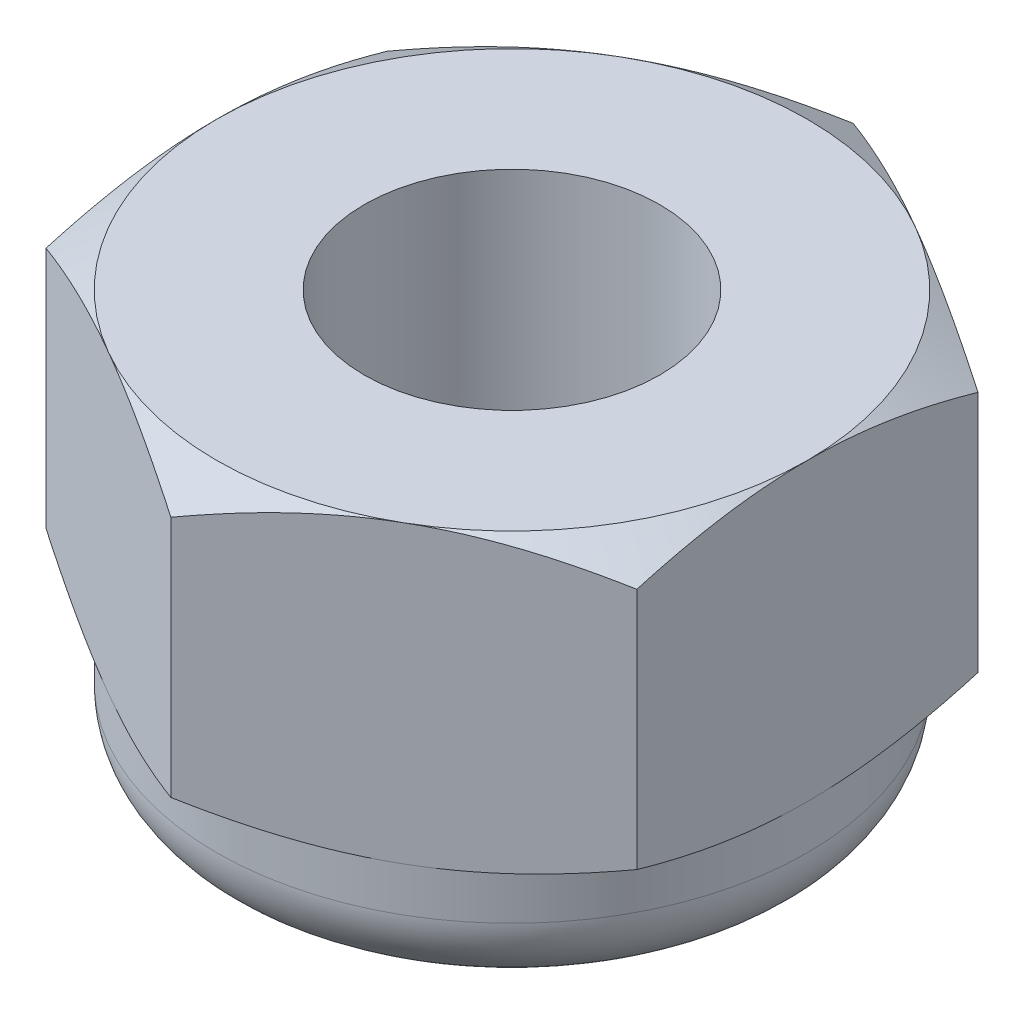
ISO-10303-21;
HEADER;
FILE_DESCRIPTION(('STEP AP214'),'2;1');
FILE_NAME('part.step','',(''),(''),'','','');
FILE_SCHEMA(('AUTOMOTIVE_DESIGN { 1 0 10303 214 1 1 1 1 }'));
ENDSEC;
DATA;
#1=APPLICATION_CONTEXT('core data for automotive mechanical design processes');
#2=APPLICATION_PROTOCOL_DEFINITION('international standard','automotive_design',2000,#1);
#3=PRODUCT_CONTEXT('',#1,'mechanical');
#4=PRODUCT('Part','Part','',(#3));
#5=PRODUCT_RELATED_PRODUCT_CATEGORY('part','',(#4));
#6=PRODUCT_DEFINITION_FORMATION('','',#4);
#7=PRODUCT_DEFINITION_CONTEXT('part definition',#1,'design');
#8=PRODUCT_DEFINITION('design','',#6,#7);
#9=PRODUCT_DEFINITION_SHAPE('','',#8);
#10=(LENGTH_UNIT() NAMED_UNIT(*) SI_UNIT(.MILLI.,.METRE.));
#11=(NAMED_UNIT(*) PLANE_ANGLE_UNIT() SI_UNIT($,.RADIAN.));
#12=(NAMED_UNIT(*) SI_UNIT($,.STERADIAN.) SOLID_ANGLE_UNIT());
#13=UNCERTAINTY_MEASURE_WITH_UNIT(LENGTH_MEASURE(1.E-05),#10,'distance_accuracy_value','');
#14=(GEOMETRIC_REPRESENTATION_CONTEXT(3) GLOBAL_UNCERTAINTY_ASSIGNED_CONTEXT((#13)) GLOBAL_UNIT_ASSIGNED_CONTEXT((#10,
#11,#12)) REPRESENTATION_CONTEXT('',''));
#15=CARTESIAN_POINT('',(0.,0.,0.));
#16=DIRECTION('',(0.,0.,1.));
#17=DIRECTION('',(1.,0.,0.));
#18=AXIS2_PLACEMENT_3D('',#15,#16,#17);
#19=CARTESIAN_POINT('',(2.,2.,1.15470053837925));
#20=DIRECTION('',(-1.,0.,0.));
#21=DIRECTION('',(0.,0.,1.));
#22=AXIS2_PLACEMENT_3D('',#19,#20,#21);
#23=PLANE('',#22);
#24=CARTESIAN_POINT('',(2.,0.978756095407433,-3.10723536680844));
#25=CARTESIAN_POINT('',(2.,0.936330863332912,-3.01982291823219));
#26=CARTESIAN_POINT('',(2.,0.89431086317883,-2.93221037878738));
#27=CARTESIAN_POINT('',(2.,0.811309169030377,-2.75647870840016));
#28=CARTESIAN_POINT('',(2.,0.77032763769453,-2.66835950071652));
#29=CARTESIAN_POINT('',(2.,0.689425807572109,-2.49105688446661));
#30=CARTESIAN_POINT('',(2.,0.649512450329226,-2.40187029759473));
#31=CARTESIAN_POINT('',(2.,0.57131209474233,-2.22278956266895));
#32=CARTESIAN_POINT('',(2.,0.533025019861076,-2.13289544814977));
#33=CARTESIAN_POINT('',(2.,0.457311353038221,-1.94935956345824));
#34=CARTESIAN_POINT('',(2.,0.419951688675203,-1.85569003285613));
#35=CARTESIAN_POINT('',(2.,0.34804642812102,-1.66725722619784));
#36=CARTESIAN_POINT('',(2.,0.313501146844893,-1.57249382909434));
#37=CARTESIAN_POINT('',(2.,0.248127262347396,-1.3818979783052));
#38=CARTESIAN_POINT('',(2.,0.217291190182717,-1.28606811236179));
#39=CARTESIAN_POINT('',(2.,0.16032134999564,-1.09303393169062));
#40=CARTESIAN_POINT('',(2.,0.13418610741452,-0.995830058317725));
#41=CARTESIAN_POINT('',(2.,0.088004663821854,-0.800519631578303));
#42=CARTESIAN_POINT('',(2.,0.0679260461447405,-0.702420887609314));
#43=CARTESIAN_POINT('',(2.,0.0349927806492822,-0.504998657700061));
#44=CARTESIAN_POINT('',(2.,0.0221374160431476,-0.405675294282897));
#45=CARTESIAN_POINT('',(2.,0.00484760332888601,-0.207596358324772));
#46=CARTESIAN_POINT('',(2.,0.000304399832631512,-0.108850556214251));
#47=CARTESIAN_POINT('',(2.,-0.00027499053746382,0.0886636690413114));
#48=CARTESIAN_POINT('',(2.,0.00368903604532294,0.187432092691779));
#49=CARTESIAN_POINT('',(2.,0.0230279822465883,0.42400790895349));
#50=CARTESIAN_POINT('',(2.,0.0423603458166526,0.561494039281412));
#51=CARTESIAN_POINT('',(2.,0.0941420038673285,0.833973970325345));
#52=CARTESIAN_POINT('',(2.,0.126603821944875,0.968965262409071));
#53=CARTESIAN_POINT('',(2.,0.201944047960998,1.23927661564325));
#54=CARTESIAN_POINT('',(2.,0.245044073308442,1.37453334872187));
#55=CARTESIAN_POINT('',(2.,0.314931252126183,1.57552896056492));
#56=CARTESIAN_POINT('',(2.,0.339097251406265,1.6422062420081));
#57=CARTESIAN_POINT('',(2.,0.388899908585125,1.77500960513522));
#58=CARTESIAN_POINT('',(2.,0.414536540528148,1.84113569652374));
#59=CARTESIAN_POINT('',(2.,0.481768746714614,2.0098882556886));
#60=CARTESIAN_POINT('',(2.,0.524243277066455,2.11216361209732));
#61=CARTESIAN_POINT('',(2.,0.611466108883442,2.31574315039746));
#62=CARTESIAN_POINT('',(2.,0.656214597675463,2.41704725145785));
#63=CARTESIAN_POINT('',(2.,0.793084875164524,2.7198353856836));
#64=CARTESIAN_POINT('',(2.,0.887808948992072,2.9201404776794));
#65=CARTESIAN_POINT('',(2.,1.08164958397818,3.31892342337664));
#66=CARTESIAN_POINT('',(2.,1.1807719397507,3.51739842382533));
#67=CARTESIAN_POINT('',(2.,1.38182194200768,3.91287779117342));
#68=CARTESIAN_POINT('',(2.,1.48374912228986,4.10988239563614));
#69=CARTESIAN_POINT('',(2.,1.67962496575455,4.48394528386546));
#70=CARTESIAN_POINT('',(2.,1.77339629287174,4.66109678041009));
#71=CARTESIAN_POINT('',(2.,1.96210959651939,5.01478564385389));
#72=CARTESIAN_POINT('',(2.,2.05705162979441,5.19132298044855));
#73=CARTESIAN_POINT('',(2.,2.24753342574158,5.54340746059359));
#74=CARTESIAN_POINT('',(2.,2.34307063024195,5.71895599016192));
#75=CARTESIAN_POINT('',(2.,2.53482345312968,6.06966713420134));
#76=CARTESIAN_POINT('',(2.,2.63103902598617,6.24482977355625));
#77=CARTESIAN_POINT('',(2.,2.72750366313233,6.41985423406967));
#78=B_SPLINE_CURVE_WITH_KNOTS('',3,(#24,#25,#26,#27,#28,#29,#30,#31,#32,#33,#34,#35,#36,#37,#38,
#39,#40,#41,#42,#43,#44,#45,#46,#47,#48,#49,#50,#51,#52,#53,#54,#55,#56,#57,#58,#59,#60,#61,#62,
#63,#64,#65,#66,#67,#68,#69,#70,#71,#72,#73,#74,#75,#76,#77),.UNSPECIFIED.,.F.,.F.,(4,2,2,2,2,2,
2,2,2,2,2,2,2,2,2,2,2,2,2,2,2,2,2,2,2,2,4),(0.,0.291495438255313,0.583036255581611,
0.876154468393304,1.16925887095091,1.47175908410079,1.77429309911686,2.07620734845282,
2.37802672737343,2.67820079177808,2.97834506363382,3.27453340260849,3.57072917339146,
3.98638730667862,4.40244285615798,4.8280307744903,5.04078368935428,5.25353285041585,
5.58572764769847,5.91794985542651,6.58257182862605,7.24809705005278,7.91351231191618,
8.51482375464892,9.11616445863758,9.71574753203119,10.3152907384778),.UNSPECIFIED.);
#79=CARTESIAN_POINT('',(2.,0.178632794953899,-1.15470053837953));
#80=VERTEX_POINT('',#79);
#81=CARTESIAN_POINT('',(2.,0.,0.));
#82=VERTEX_POINT('',#81);
#83=EDGE_CURVE('E148',#80,#82,#78,.T.);
#84=ORIENTED_EDGE('',*,*,#83,.F.);
#85=DIRECTION('',(0.,-1.,0.));
#86=VECTOR('',#85,1.);
#87=CARTESIAN_POINT('',(2.,2.,-1.15470053837925));
#88=LINE('',#87,#86);
#89=CARTESIAN_POINT('',(2.,1.82136720504592,-1.15470053837925));
#90=VERTEX_POINT('',#89);
#91=EDGE_CURVE('E157',#90,#80,#88,.T.);
#92=ORIENTED_EDGE('',*,*,#91,.F.);
#93=CARTESIAN_POINT('',(2.,1.02124390459258,-3.10723536680844));
#94=CARTESIAN_POINT('',(2.,1.0636691366671,-3.01982291823219));
#95=CARTESIAN_POINT('',(2.,1.10568913682119,-2.93221037878738));
#96=CARTESIAN_POINT('',(2.,1.18869083096964,-2.75647870840016));
#97=CARTESIAN_POINT('',(2.,1.22967236230548,-2.66835950071652));
#98=CARTESIAN_POINT('',(2.,1.3105741924279,-2.49105688446661));
#99=CARTESIAN_POINT('',(2.,1.35048754967079,-2.40187029759472));
#100=CARTESIAN_POINT('',(2.,1.42868790525768,-2.22278956266895));
#101=CARTESIAN_POINT('',(2.,1.46697498013893,-2.13289544814976));
#102=CARTESIAN_POINT('',(2.,1.54268864696179,-1.94935956345823));
#103=CARTESIAN_POINT('',(2.,1.58004831132481,-1.85569003285612));
#104=CARTESIAN_POINT('',(2.,1.65195357187899,-1.66725722619784));
#105=CARTESIAN_POINT('',(2.,1.68649885315511,-1.57249382909433));
#106=CARTESIAN_POINT('',(2.,1.75187273765261,-1.3818979783052));
#107=CARTESIAN_POINT('',(2.,1.78270880981729,-1.28606811236179));
#108=CARTESIAN_POINT('',(2.,1.83967865000436,-1.09303393169062));
#109=CARTESIAN_POINT('',(2.,1.86581389258548,-0.995830058317724));
#110=CARTESIAN_POINT('',(2.,1.91199533617815,-0.800519631578301));
#111=CARTESIAN_POINT('',(2.,1.93207395385526,-0.702420887609313));
#112=CARTESIAN_POINT('',(2.,1.96500721935072,-0.50499865770006));
#113=CARTESIAN_POINT('',(2.,1.97786258395685,-0.405675294282897));
#114=CARTESIAN_POINT('',(2.,1.99515239667111,-0.207596358324772));
#115=CARTESIAN_POINT('',(2.,1.99969560016737,-0.108850556214251));
#116=CARTESIAN_POINT('',(2.,2.00027499053746,0.0886636690413102));
#117=CARTESIAN_POINT('',(2.,1.99631096395468,0.187432092691778));
#118=CARTESIAN_POINT('',(2.,1.97697201775341,0.424007908953491));
#119=CARTESIAN_POINT('',(2.,1.95763965418335,0.561494039281416));
#120=CARTESIAN_POINT('',(2.,1.90585799613267,0.833973970325356));
#121=CARTESIAN_POINT('',(2.,1.87339617805512,0.968965262409084));
#122=CARTESIAN_POINT('',(2.,1.798055952039,1.23927661564327));
#123=CARTESIAN_POINT('',(2.,1.75495592669156,1.37453334872189));
#124=CARTESIAN_POINT('',(2.,1.68506874787381,1.57552896056494));
#125=CARTESIAN_POINT('',(2.,1.66090274859373,1.64220624200813));
#126=CARTESIAN_POINT('',(2.,1.61110009141487,1.77500960513525));
#127=CARTESIAN_POINT('',(2.,1.58546345947185,1.84113569652377));
#128=CARTESIAN_POINT('',(2.,1.51823125328538,2.00988825568864));
#129=CARTESIAN_POINT('',(2.,1.47575672293354,2.11216361209735));
#130=CARTESIAN_POINT('',(2.,1.38853389111655,2.31574315039749));
#131=CARTESIAN_POINT('',(2.,1.34378540232453,2.41704725145788));
#132=CARTESIAN_POINT('',(2.,1.20691512483548,2.71983538568363));
#133=CARTESIAN_POINT('',(2.,1.11219105100793,2.92014047767944));
#134=CARTESIAN_POINT('',(2.,0.918350416021822,3.31892342337667));
#135=CARTESIAN_POINT('',(2.,0.8192280602493,3.51739842382536));
#136=CARTESIAN_POINT('',(2.,0.618178057992325,3.91287779117345));
#137=CARTESIAN_POINT('',(2.,0.516250877710148,4.10988239563617));
#138=CARTESIAN_POINT('',(2.,0.320375034245468,4.48394528386549));
#139=CARTESIAN_POINT('',(2.,0.226603707128277,4.66109678041012));
#140=CARTESIAN_POINT('',(2.,0.0378904034806254,5.01478564385392));
#141=CARTESIAN_POINT('',(2.,-0.0570516297943871,5.19132298044858));
#142=CARTESIAN_POINT('',(2.,-0.247533425741555,5.54340746059362));
#143=CARTESIAN_POINT('',(2.,-0.343070630241926,5.71895599016195));
#144=CARTESIAN_POINT('',(2.,-0.534823453129656,6.06966713420137));
#145=CARTESIAN_POINT('',(2.,-0.631039025986142,6.24482977355628));
#146=CARTESIAN_POINT('',(2.,-0.727503663132301,6.41985423406971));
#147=B_SPLINE_CURVE_WITH_KNOTS('',3,(#93,#94,#95,#96,#97,#98,#99,#100,#101,#102,#103,#104,#105,
#106,#107,#108,#109,#110,#111,#112,#113,#114,#115,#116,#117,#118,#119,#120,#121,#122,#123,#124,
#125,#126,#127,#128,#129,#130,#131,#132,#133,#134,#135,#136,#137,#138,#139,#140,#141,#142,#143,
#144,#145,#146),.UNSPECIFIED.,.F.,.F.,(4,2,2,2,2,2,2,2,2,2,2,2,2,2,2,2,2,2,2,2,2,2,2,2,2,2,4),
(0.,0.291495438255313,0.583036255581611,0.876154468393303,1.16925887095091,1.47175908410079,
1.77429309911686,2.07620734845282,2.37802672737343,2.67820079177807,2.97834506363381,
3.27453340260848,3.57072917339145,3.98638730667862,4.40244285615799,4.82803077449032,
5.0407836893543,5.25353285041588,5.5857276476985,5.91794985542653,6.58257182862607,
7.24809705005279,7.91351231191619,8.51482375464894,9.11616445863759,9.7157475320312,
10.3152907384778),.UNSPECIFIED.);
#148=CARTESIAN_POINT('',(2.,2.,0.));
#149=VERTEX_POINT('',#148);
#150=EDGE_CURVE('E222',#149,#90,#147,.F.);
#151=ORIENTED_EDGE('',*,*,#150,.F.);
#152=CARTESIAN_POINT('',(2.,1.82136720504592,1.15470053837925));
#153=VERTEX_POINT('',#152);
#154=EDGE_CURVE('E229',#153,#149,#147,.F.);
#155=ORIENTED_EDGE('',*,*,#154,.F.);
#156=DIRECTION('',(0.,-1.,0.));
#157=VECTOR('',#156,1.);
#158=CARTESIAN_POINT('',(2.,2.,1.15470053837925));
#159=LINE('',#158,#157);
#160=CARTESIAN_POINT('',(2.,0.178632794954083,1.15470053837925));
#161=VERTEX_POINT('',#160);
#162=EDGE_CURVE('E240',#153,#161,#159,.T.);
#163=ORIENTED_EDGE('',*,*,#162,.T.);
#164=EDGE_CURVE('E212',#82,#161,#78,.T.);
#165=ORIENTED_EDGE('',*,*,#164,.F.);
#166=EDGE_LOOP('',(#84,#92,#151,#155,#163,#165));
#167=FACE_BOUND('',#166,.T.);
#168=ADVANCED_FACE('F36',(#167),#23,.F.);
#169=CARTESIAN_POINT('',(2.,2.,-1.15470053837925));
#170=DIRECTION('',(-0.5,0.,0.866025403784439));
#171=DIRECTION('',(0.866025403784439,0.,0.5));
#172=AXIS2_PLACEMENT_3D('',#169,#170,#171);
#173=PLANE('',#172);
#174=CARTESIAN_POINT('',(-0.000199999999999645,0.1786994666205,-2.30951654681234));
#175=CARTESIAN_POINT('',(0.0876912629000605,0.14938953610068,-2.25877250251758));
#176=CARTESIAN_POINT('',(0.176341194473592,0.122732851980468,-2.20759044065996));
#177=CARTESIAN_POINT('',(0.355176246997803,0.0762024910207222,-2.10433997494456));
#178=CARTESIAN_POINT('',(0.445364546505037,0.0563452763827803,-2.0522697359463));
#179=CARTESIAN_POINT('',(0.624623385763307,0.0254334640232535,-1.94877459684592));
#180=CARTESIAN_POINT('',(0.713666338226305,0.0141731515985319,-1.89736562427197));
#181=CARTESIAN_POINT('',(0.892171397785044,0.000728662594642558,-1.79430568008402));
#182=CARTESIAN_POINT('',(0.981632855703959,-0.00146664504653098,-1.74265508327244));
#183=CARTESIAN_POINT('',(1.1488083535488,0.00309098933064971,-1.64613626458981));
#184=CARTESIAN_POINT('',(1.22654737026578,0.00872487468701545,-1.60125362236173));
#185=CARTESIAN_POINT('',(1.38151891453613,0.0265838952608293,-1.51178075956051));
#186=CARTESIAN_POINT('',(1.4587509057412,0.0388151360234405,-1.46719084864821));
#187=CARTESIAN_POINT('',(1.6140421864822,0.0693934368676112,-1.37753338590959));
#188=CARTESIAN_POINT('',(1.69208181310738,0.0878701670657173,-1.33247718647009));
#189=CARTESIAN_POINT('',(1.84699686569213,0.129805518212857,-1.24303693915875));
#190=CARTESIAN_POINT('',(1.92387427762312,0.153254280492315,-1.1986517446858));
#191=CARTESIAN_POINT('',(2.0002,0.178699466620499,-1.15458506832541));
#192=B_SPLINE_CURVE_WITH_KNOTS('',3,(#174,#175,#176,#177,#178,#179,#180,#181,#182,#183,#184,
#185,#186,#187,#188,#189,#190,#191),.UNSPECIFIED.,.F.,.F.,(4,2,2,2,2,2,2,2,4),(0.,
0.31703182469561,0.634825876346564,0.944753967652636,1.25430138000371,1.52387047293094,
1.79368946861028,2.06949491027634,2.34475850821472),.UNSPECIFIED.);
#193=CARTESIAN_POINT('',(0.,0.178632794954083,-2.3094010767585));
#194=VERTEX_POINT('',#193);
#195=CARTESIAN_POINT('',(1.,0.,-1.73205080756888));
#196=VERTEX_POINT('',#195);
#197=EDGE_CURVE('E135',#194,#196,#192,.T.);
#198=ORIENTED_EDGE('',*,*,#197,.F.);
#199=DIRECTION('',(0.,-1.,0.));
#200=VECTOR('',#199,1.);
#201=CARTESIAN_POINT('',(0.,2.,-2.3094010767585));
#202=LINE('',#201,#200);
#203=CARTESIAN_POINT('',(0.,1.82136720504592,-2.3094010767585));
#204=VERTEX_POINT('',#203);
#205=EDGE_CURVE('E252',#204,#194,#202,.T.);
#206=ORIENTED_EDGE('',*,*,#205,.F.);
#207=CARTESIAN_POINT('',(2.0002,1.8213005333795,-1.15458506832541));
#208=CARTESIAN_POINT('',(1.91230873709994,1.85061046389932,-1.20532911262018));
#209=CARTESIAN_POINT('',(1.82365880552641,1.87726714801953,-1.2565111744778));
#210=CARTESIAN_POINT('',(1.6448237530022,1.92379750897928,-1.35976164019319));
#211=CARTESIAN_POINT('',(1.55463545349496,1.94365472361722,-1.41183187919145));
#212=CARTESIAN_POINT('',(1.37537661423669,1.97456653597675,-1.51532701829183));
#213=CARTESIAN_POINT('',(1.2863336617737,1.98582684840147,-1.56673599086578));
#214=CARTESIAN_POINT('',(1.10782860221496,1.99927133740536,-1.66979593505373));
#215=CARTESIAN_POINT('',(1.01836714429604,2.00146664504653,-1.72144653186531));
#216=CARTESIAN_POINT('',(0.851191646451203,1.99690901066935,-1.81796535054794));
#217=CARTESIAN_POINT('',(0.773452629734217,1.99127512531298,-1.86284799277603));
#218=CARTESIAN_POINT('',(0.618481085463868,1.97341610473917,-1.95232085557725));
#219=CARTESIAN_POINT('',(0.541249094258803,1.96118486397656,-1.99691076648954));
#220=CARTESIAN_POINT('',(0.3859578135178,1.93060656313239,-2.08656822922816));
#221=CARTESIAN_POINT('',(0.307918186892621,1.91212983293428,-2.13162442866767));
#222=CARTESIAN_POINT('',(0.153003134307866,1.87019448178714,-2.221064675979));
#223=CARTESIAN_POINT('',(0.0761257223768802,1.84674571950769,-2.26544987045196));
#224=CARTESIAN_POINT('',(-0.000199999999999858,1.8213005333795,-2.30951654681234));
#225=B_SPLINE_CURVE_WITH_KNOTS('',3,(#207,#208,#209,#210,#211,#212,#213,#214,#215,#216,#217,
#218,#219,#220,#221,#222,#223,#224),.UNSPECIFIED.,.F.,.F.,(4,2,2,2,2,2,2,2,4),(0.,
0.317031824695609,0.634825876346562,0.944753967652634,1.25430138000371,1.52387047293094,
1.79368946861028,2.06949491027634,2.34475850821472),.UNSPECIFIED.);
#226=CARTESIAN_POINT('',(1.,2.,-1.73205080756888));
#227=VERTEX_POINT('',#226);
#228=EDGE_CURVE('E231',#227,#204,#225,.T.);
#229=ORIENTED_EDGE('',*,*,#228,.F.);
#230=EDGE_CURVE('E230',#90,#227,#225,.T.);
#231=ORIENTED_EDGE('',*,*,#230,.F.);
#232=ORIENTED_EDGE('',*,*,#91,.T.);
#233=EDGE_CURVE('E143',#196,#80,#192,.T.);
#234=ORIENTED_EDGE('',*,*,#233,.F.);
#235=EDGE_LOOP('',(#198,#206,#229,#231,#232,#234));
#236=FACE_BOUND('',#235,.T.);
#237=ADVANCED_FACE('F154',(#236),#173,.F.);
#238=CARTESIAN_POINT('',(0.,2.,-2.3094010767585));
#239=DIRECTION('',(0.5,0.,0.866025403784439));
#240=DIRECTION('',(0.866025403784439,0.,-0.5));
#241=AXIS2_PLACEMENT_3D('',#238,#239,#240);
#242=PLANE('',#241);
#243=CARTESIAN_POINT('',(-2.0002,0.1786994666205,-1.15458506832541));
#244=CARTESIAN_POINT('',(-1.91230873709994,0.149389536100681,-1.20532911262018));
#245=CARTESIAN_POINT('',(-1.82365880552641,0.122732851980468,-1.2565111744778));
#246=CARTESIAN_POINT('',(-1.6448237530022,0.0762024910207224,-1.35976164019319));
#247=CARTESIAN_POINT('',(-1.55463545349496,0.0563452763827804,-1.41183187919145));
#248=CARTESIAN_POINT('',(-1.37537661423669,0.0254334640232536,-1.51532701829183));
#249=CARTESIAN_POINT('',(-1.2863336617737,0.0141731515985321,-1.56673599086578));
#250=CARTESIAN_POINT('',(-1.10782860221496,0.000728662594642656,-1.66979593505373));
#251=CARTESIAN_POINT('',(-1.01836714429604,-0.00146664504653101,-1.72144653186531));
#252=CARTESIAN_POINT('',(-0.851191646451201,0.00309098933064974,-1.81796535054794));
#253=CARTESIAN_POINT('',(-0.773452629734215,0.00872487468701564,-1.86284799277603));
#254=CARTESIAN_POINT('',(-0.618481085463866,0.0265838952608296,-1.95232085557725));
#255=CARTESIAN_POINT('',(-0.541249094258801,0.0388151360234406,-1.99691076648954));
#256=CARTESIAN_POINT('',(-0.385957813517798,0.0693934368676112,-2.08656822922816));
#257=CARTESIAN_POINT('',(-0.30791818689262,0.0878701670657173,-2.13162442866767));
#258=CARTESIAN_POINT('',(-0.153003134307865,0.129805518212858,-2.221064675979));
#259=CARTESIAN_POINT('',(-0.0761257223768792,0.153254280492315,-2.26544987045196));
#260=CARTESIAN_POINT('',(0.000200000000000784,0.1786994666205,-2.30951654681234));
#261=B_SPLINE_CURVE_WITH_KNOTS('',3,(#243,#244,#245,#246,#247,#248,#249,#250,#251,#252,#253,
#254,#255,#256,#257,#258,#259,#260),.UNSPECIFIED.,.F.,.F.,(4,2,2,2,2,2,2,2,4),(0.,
0.31703182469561,0.634825876346564,0.944753967652637,1.25430138000371,1.52387047293094,
1.79368946861028,2.06949491027634,2.34475850821472),.UNSPECIFIED.);
#262=CARTESIAN_POINT('',(-2.,0.178632794953899,-1.15470053837953));
#263=VERTEX_POINT('',#262);
#264=CARTESIAN_POINT('',(-0.999999999999999,0.,-1.73205080756888));
#265=VERTEX_POINT('',#264);
#266=EDGE_CURVE('E309',#263,#265,#261,.T.);
#267=ORIENTED_EDGE('',*,*,#266,.F.);
#268=DIRECTION('',(0.,-1.,0.));
#269=VECTOR('',#268,1.);
#270=CARTESIAN_POINT('',(-2.,2.,-1.15470053837925));
#271=LINE('',#270,#269);
#272=CARTESIAN_POINT('',(-2.,1.8213672050461,-1.15470053837953));
#273=VERTEX_POINT('',#272);
#274=EDGE_CURVE('E249',#273,#263,#271,.T.);
#275=ORIENTED_EDGE('',*,*,#274,.F.);
#276=CARTESIAN_POINT('',(0.000200000000000387,1.8213005333795,-2.30951654681234));
#277=CARTESIAN_POINT('',(-0.0876912629000595,1.85061046389932,-2.25877250251758));
#278=CARTESIAN_POINT('',(-0.176341194473591,1.87726714801953,-2.20759044065996));
#279=CARTESIAN_POINT('',(-0.355176246997801,1.92379750897928,-2.10433997494456));
#280=CARTESIAN_POINT('',(-0.445364546505036,1.94365472361722,-2.05226973594631));
#281=CARTESIAN_POINT('',(-0.624623385763305,1.97456653597675,-1.94877459684592));
#282=CARTESIAN_POINT('',(-0.713666338226303,1.98582684840147,-1.89736562427197));
#283=CARTESIAN_POINT('',(-0.892171397785042,1.99927133740536,-1.79430568008402));
#284=CARTESIAN_POINT('',(-0.981632855703957,2.00146664504653,-1.74265508327244));
#285=CARTESIAN_POINT('',(-1.1488083535488,1.99690901066935,-1.64613626458981));
#286=CARTESIAN_POINT('',(-1.22654737026578,1.99127512531299,-1.60125362236173));
#287=CARTESIAN_POINT('',(-1.38151891453613,1.97341610473917,-1.51178075956051));
#288=CARTESIAN_POINT('',(-1.4587509057412,1.96118486397656,-1.46719084864821));
#289=CARTESIAN_POINT('',(-1.6140421864822,1.93060656313239,-1.37753338590959));
#290=CARTESIAN_POINT('',(-1.69208181310738,1.91212983293428,-1.33247718647009));
#291=CARTESIAN_POINT('',(-1.84699686569213,1.87019448178714,-1.24303693915875));
#292=CARTESIAN_POINT('',(-1.92387427762312,1.84674571950769,-1.1986517446858));
#293=CARTESIAN_POINT('',(-2.0002,1.8213005333795,-1.15458506832541));
#294=B_SPLINE_CURVE_WITH_KNOTS('',3,(#276,#277,#278,#279,#280,#281,#282,#283,#284,#285,#286,
#287,#288,#289,#290,#291,#292,#293),.UNSPECIFIED.,.F.,.F.,(4,2,2,2,2,2,2,2,4),(0.,
0.317031824695609,0.634825876346563,0.944753967652634,1.25430138000371,1.52387047293094,
1.79368946861028,2.06949491027634,2.34475850821472),.UNSPECIFIED.);
#295=CARTESIAN_POINT('',(-1.,2.,-1.73205080756888));
#296=VERTEX_POINT('',#295);
#297=EDGE_CURVE('E291',#296,#273,#294,.T.);
#298=ORIENTED_EDGE('',*,*,#297,.F.);
#299=EDGE_CURVE('E296',#204,#296,#294,.T.);
#300=ORIENTED_EDGE('',*,*,#299,.F.);
#301=ORIENTED_EDGE('',*,*,#205,.T.);
#302=EDGE_CURVE('E137',#265,#194,#261,.T.);
#303=ORIENTED_EDGE('',*,*,#302,.F.);
#304=EDGE_LOOP('',(#267,#275,#298,#300,#301,#303));
#305=FACE_BOUND('',#304,.T.);
#306=ADVANCED_FACE('F297',(#305),#242,.F.);
#307=CARTESIAN_POINT('',(-2.,2.,-1.15470053837925));
#308=DIRECTION('',(1.,0.,0.));
#309=DIRECTION('',(0.,0.,-1.));
#310=AXIS2_PLACEMENT_3D('',#307,#308,#309);
#311=PLANE('',#310);
#312=CARTESIAN_POINT('',(-2.,0.97875609535379,-3.10723536669795));
#313=CARTESIAN_POINT('',(-2.,0.936330863281514,-3.01982291812541));
#314=CARTESIAN_POINT('',(-2.,0.894310863129675,-2.93221037868432));
#315=CARTESIAN_POINT('',(-2.,0.811309168985699,-2.75647870830454));
#316=CARTESIAN_POINT('',(-2.,0.770327637652085,-2.66835950062463));
#317=CARTESIAN_POINT('',(-2.,0.689425807534132,-2.49105688438224));
#318=CARTESIAN_POINT('',(-2.,0.649512450293482,-2.40187029751414));
#319=CARTESIAN_POINT('',(-2.,0.571312094711017,-2.22278956259597));
#320=CARTESIAN_POINT('',(-2.,0.533025019831961,-2.1328954480806));
#321=CARTESIAN_POINT('',(-2.,0.457311353013554,-1.94935956339698));
#322=CARTESIAN_POINT('',(-2.,0.419951688652782,-1.85569003279897));
#323=CARTESIAN_POINT('',(-2.,0.348046428102969,-1.66725722614894));
#324=CARTESIAN_POINT('',(-2.,0.313501146828967,-1.5724938290496));
#325=CARTESIAN_POINT('',(-2.,0.248127262335514,-1.38189797826887));
#326=CARTESIAN_POINT('',(-2.,0.217291190172755,-1.2860681123297));
#327=CARTESIAN_POINT('',(-2.,0.160321349989199,-1.09303393166713));
#328=CARTESIAN_POINT('',(-2.,0.13418610740968,-0.995830058298589));
#329=CARTESIAN_POINT('',(-2.,0.0880046638202398,-0.800519631570149));
#330=CARTESIAN_POINT('',(-2.,0.0679260461446231,-0.702420887607818));
#331=CARTESIAN_POINT('',(-2.,0.0349927806511484,-0.504998657712037));
#332=CARTESIAN_POINT('',(-2.,0.0221374160455017,-0.405675294301687));
#333=CARTESIAN_POINT('',(-2.,0.00484760333100355,-0.207596358357075));
#334=CARTESIAN_POINT('',(-2.,0.000304399834046624,-0.108850556253253));
#335=CARTESIAN_POINT('',(-2.,-0.000274990538612278,0.0886636689890198));
#336=CARTESIAN_POINT('',(-2.,0.00368903604231298,0.187432092632897));
#337=CARTESIAN_POINT('',(-2.,0.0230279822384204,0.424007908884414));
#338=CARTESIAN_POINT('',(-2.,0.0423603458053599,0.561494039208797));
#339=CARTESIAN_POINT('',(-2.,0.0941420038497061,0.833973970245913));
#340=CARTESIAN_POINT('',(-2.,0.126603821924048,0.968965262326359));
#341=CARTESIAN_POINT('',(-2.,0.201944047933828,1.23927661555394));
#342=CARTESIAN_POINT('',(-2.,0.245044073278133,1.37453334862926));
#343=CARTESIAN_POINT('',(-2.,0.314931252091323,1.57552896046736));
#344=CARTESIAN_POINT('',(-2.,0.339097251369916,1.64220624190891));
#345=CARTESIAN_POINT('',(-2.,0.388899908545846,1.77500960503275));
#346=CARTESIAN_POINT('',(-2.,0.414536540487429,1.84113569641962));
#347=CARTESIAN_POINT('',(-2.,0.481768746671532,2.00988825558346));
#348=CARTESIAN_POINT('',(-2.,0.524243277022575,2.11216361199275));
#349=CARTESIAN_POINT('',(-2.,0.611466108838181,2.31574315029396));
#350=CARTESIAN_POINT('',(-2.,0.656214597629619,2.41704725135485));
#351=CARTESIAN_POINT('',(-2.,0.793084875117167,2.71983538558203));
#352=CARTESIAN_POINT('',(-2.,0.887808948944018,2.92014047757868));
#353=CARTESIAN_POINT('',(-2.,1.08164958392909,3.31892342327748));
#354=CARTESIAN_POINT('',(-2.,1.18077193970127,3.51739842372691));
#355=CARTESIAN_POINT('',(-2.,1.38182194195775,3.91287779107638));
#356=CARTESIAN_POINT('',(-2.,1.48374912223979,4.10988239553973));
#357=CARTESIAN_POINT('',(-2.,1.67962496570403,4.4839452837697));
#358=CARTESIAN_POINT('',(-2.,1.77339629282093,4.66109678031435));
#359=CARTESIAN_POINT('',(-2.,1.96210959646804,5.01478564375816));
#360=CARTESIAN_POINT('',(-2.,2.05705162974282,5.19132298035281));
#361=CARTESIAN_POINT('',(-2.,2.24753342568951,5.54340746049773));
#362=CARTESIAN_POINT('',(-2.,2.34307063018964,5.71895599006594));
#363=CARTESIAN_POINT('',(-2.,2.53482345307692,6.06966713410512));
#364=CARTESIAN_POINT('',(-2.,2.63103902593319,6.24482977345991));
#365=CARTESIAN_POINT('',(-2.,2.72750366307915,6.41985423397319));
#366=B_SPLINE_CURVE_WITH_KNOTS('',3,(#312,#313,#314,#315,#316,#317,#318,#319,#320,#321,#322,
#323,#324,#325,#326,#327,#328,#329,#330,#331,#332,#333,#334,#335,#336,#337,#338,#339,#340,#341,
#342,#343,#344,#345,#346,#347,#348,#349,#350,#351,#352,#353,#354,#355,#356,#357,#358,#359,#360,
#361,#362,#363,#364,#365),.UNSPECIFIED.,.F.,.F.,(4,2,2,2,2,2,2,2,2,2,2,2,2,2,2,2,2,2,2,2,2,2,2,
2,2,2,4),(0.,0.291495438242345,0.583036255555676,0.876154468354256,1.16925887089875,
1.47175908403472,1.77429309903688,2.07620734835897,2.37802672726573,2.67820079164995,
2.9783450634853,3.27453340244007,3.57072917320313,3.98638730647848,4.40244285594601,
4.828030774266,5.04078368912382,5.25353285017925,5.58572764746253,5.91794985519123,
6.58257182839213,7.24809704982037,7.91351231168526,8.51482375441764,9.11616445840593,
9.7157475317989,10.3152907382448),.UNSPECIFIED.);
#367=CARTESIAN_POINT('',(-2.,0.178632794954083,1.15470053837925));
#368=VERTEX_POINT('',#367);
#369=CARTESIAN_POINT('',(-2.,0.,0.));
#370=VERTEX_POINT('',#369);
#371=EDGE_CURVE('E158',#368,#370,#366,.F.);
#372=ORIENTED_EDGE('',*,*,#371,.F.);
#373=DIRECTION('',(0.,-1.,0.));
#374=VECTOR('',#373,1.);
#375=CARTESIAN_POINT('',(-2.,2.,1.15470053837925));
#376=LINE('',#375,#374);
#377=CARTESIAN_POINT('',(-2.,1.82136720504592,1.15470053837925));
#378=VERTEX_POINT('',#377);
#379=EDGE_CURVE('E246',#378,#368,#376,.T.);
#380=ORIENTED_EDGE('',*,*,#379,.F.);
#381=CARTESIAN_POINT('',(-2.,1.02124390464623,-3.10723536669795));
#382=CARTESIAN_POINT('',(-2.,1.0636691367185,-3.01982291812541));
#383=CARTESIAN_POINT('',(-2.,1.10568913687034,-2.93221037868432));
#384=CARTESIAN_POINT('',(-2.,1.18869083101432,-2.75647870830454));
#385=CARTESIAN_POINT('',(-2.,1.22967236234793,-2.66835950062463));
#386=CARTESIAN_POINT('',(-2.,1.31057419246588,-2.49105688438224));
#387=CARTESIAN_POINT('',(-2.,1.35048754970653,-2.40187029751414));
#388=CARTESIAN_POINT('',(-2.,1.42868790528899,-2.22278956259597));
#389=CARTESIAN_POINT('',(-2.,1.46697498016805,-2.1328954480806));
#390=CARTESIAN_POINT('',(-2.,1.54268864698646,-1.94935956339698));
#391=CARTESIAN_POINT('',(-2.,1.58004831134723,-1.85569003279897));
#392=CARTESIAN_POINT('',(-2.,1.65195357189704,-1.66725722614894));
#393=CARTESIAN_POINT('',(-2.,1.68649885317104,-1.5724938290496));
#394=CARTESIAN_POINT('',(-2.,1.75187273766449,-1.38189797826886));
#395=CARTESIAN_POINT('',(-2.,1.78270880982725,-1.2860681123297));
#396=CARTESIAN_POINT('',(-2.,1.8396786500108,-1.09303393166713));
#397=CARTESIAN_POINT('',(-2.,1.86581389259032,-0.995830058298588));
#398=CARTESIAN_POINT('',(-2.,1.91199533617976,-0.800519631570149));
#399=CARTESIAN_POINT('',(-2.,1.93207395385538,-0.702420887607818));
#400=CARTESIAN_POINT('',(-2.,1.96500721934885,-0.504998657712037));
#401=CARTESIAN_POINT('',(-2.,1.9778625839545,-0.405675294301688));
#402=CARTESIAN_POINT('',(-2.,1.995152396669,-0.207596358357077));
#403=CARTESIAN_POINT('',(-2.,1.99969560016595,-0.108850556253254));
#404=CARTESIAN_POINT('',(-2.,2.00027499053861,0.0886636689890182));
#405=CARTESIAN_POINT('',(-2.,1.99631096395769,0.187432092632895));
#406=CARTESIAN_POINT('',(-2.,1.97697201776158,0.424007908884414));
#407=CARTESIAN_POINT('',(-2.,1.95763965419464,0.5614940392088));
#408=CARTESIAN_POINT('',(-2.,1.90585799615029,0.833973970245921));
#409=CARTESIAN_POINT('',(-2.,1.87339617807595,0.96896526232637));
#410=CARTESIAN_POINT('',(-2.,1.79805595206617,1.23927661555396));
#411=CARTESIAN_POINT('',(-2.,1.75495592672187,1.37453334862928));
#412=CARTESIAN_POINT('',(-2.,1.68506874790867,1.57552896046739));
#413=CARTESIAN_POINT('',(-2.,1.66090274863008,1.64220624190894));
#414=CARTESIAN_POINT('',(-2.,1.61110009145415,1.77500960503277));
#415=CARTESIAN_POINT('',(-2.,1.58546345951257,1.84113569641965));
#416=CARTESIAN_POINT('',(-2.,1.51823125332846,2.00988825558349));
#417=CARTESIAN_POINT('',(-2.,1.47575672297742,2.11216361199278));
#418=CARTESIAN_POINT('',(-2.,1.38853389116182,2.31574315029399));
#419=CARTESIAN_POINT('',(-2.,1.34378540237038,2.41704725135488));
#420=CARTESIAN_POINT('',(-2.,1.20691512488283,2.71983538558207));
#421=CARTESIAN_POINT('',(-2.,1.11219105105598,2.92014047757871));
#422=CARTESIAN_POINT('',(-2.,0.918350416070917,3.31892342327751));
#423=CARTESIAN_POINT('',(-2.,0.819228060298738,3.51739842372694));
#424=CARTESIAN_POINT('',(-2.,0.618178058042253,3.91287779107641));
#425=CARTESIAN_POINT('',(-2.,0.516250877760224,4.10988239553976));
#426=CARTESIAN_POINT('',(-2.,0.320375034295978,4.48394528376973));
#427=CARTESIAN_POINT('',(-2.,0.226603707179087,4.66109678031438));
#428=CARTESIAN_POINT('',(-2.,0.0378904035319746,5.01478564375819));
#429=CARTESIAN_POINT('',(-2.,-0.057051629742799,5.19132298035284));
#430=CARTESIAN_POINT('',(-2.,-0.247533425689487,5.54340746049776));
#431=CARTESIAN_POINT('',(-2.,-0.343070630189615,5.71895599006598));
#432=CARTESIAN_POINT('',(-2.,-0.53482345307689,6.06966713410516));
#433=CARTESIAN_POINT('',(-2.,-0.631039025933165,6.24482977345994));
#434=CARTESIAN_POINT('',(-2.,-0.727503663079121,6.41985423397323));
#435=B_SPLINE_CURVE_WITH_KNOTS('',3,(#381,#382,#383,#384,#385,#386,#387,#388,#389,#390,#391,
#392,#393,#394,#395,#396,#397,#398,#399,#400,#401,#402,#403,#404,#405,#406,#407,#408,#409,#410,
#411,#412,#413,#414,#415,#416,#417,#418,#419,#420,#421,#422,#423,#424,#425,#426,#427,#428,#429,
#430,#431,#432,#433,#434),.UNSPECIFIED.,.F.,.F.,(4,2,2,2,2,2,2,2,2,2,2,2,2,2,2,2,2,2,2,2,2,2,2,
2,2,2,4),(0.,0.291495438242345,0.583036255555675,0.876154468354256,1.16925887089875,
1.47175908403472,1.77429309903688,2.07620734835897,2.37802672726572,2.67820079164995,
2.97834506348529,3.27453340244006,3.57072917320312,3.98638730647848,4.40244285594602,
4.82803077426602,5.04078368912384,5.25353285017927,5.58572764746255,5.91794985519125,
6.58257182839215,7.24809704982039,7.91351231168528,8.51482375441766,9.11616445840594,
9.71574753179891,10.3152907382448),.UNSPECIFIED.);
#436=CARTESIAN_POINT('',(-2.,2.,0.));
#437=VERTEX_POINT('',#436);
#438=EDGE_CURVE('E285',#437,#378,#435,.T.);
#439=ORIENTED_EDGE('',*,*,#438,.F.);
#440=EDGE_CURVE('E290',#273,#437,#435,.T.);
#441=ORIENTED_EDGE('',*,*,#440,.F.);
#442=ORIENTED_EDGE('',*,*,#274,.T.);
#443=EDGE_CURVE('E142',#370,#263,#366,.F.);
#444=ORIENTED_EDGE('',*,*,#443,.F.);
#445=EDGE_LOOP('',(#372,#380,#439,#441,#442,#444));
#446=FACE_BOUND('',#445,.T.);
#447=ADVANCED_FACE('F272',(#446),#311,.F.);
#448=CARTESIAN_POINT('',(-2.,2.,1.15470053837925));
#449=DIRECTION('',(0.5,0.,-0.866025403784439));
#450=DIRECTION('',(-0.866025403784439,0.,-0.5));
#451=AXIS2_PLACEMENT_3D('',#448,#449,#450);
#452=PLANE('',#451);
#453=CARTESIAN_POINT('',(0.000200000000000486,0.1786994666205,2.30951654681234));
#454=CARTESIAN_POINT('',(-0.0876912629000597,0.149389536100681,2.25877250251758));
#455=CARTESIAN_POINT('',(-0.176341194473591,0.122732851980468,2.20759044065995));
#456=CARTESIAN_POINT('',(-0.355176246997802,0.0762024910207222,2.10433997494456));
#457=CARTESIAN_POINT('',(-0.445364546505036,0.05634527638278,2.0522697359463));
#458=CARTESIAN_POINT('',(-0.624623385763306,0.0254334640232532,1.94877459684592));
#459=CARTESIAN_POINT('',(-0.713666338226304,0.0141731515985319,1.89736562427197));
#460=CARTESIAN_POINT('',(-0.892171397785043,0.000728662594642584,1.79430568008402));
#461=CARTESIAN_POINT('',(-0.981632855703958,-0.00146664504653125,1.74265508327244));
#462=CARTESIAN_POINT('',(-1.1488083535488,0.00309098933064937,1.64613626458981));
#463=CARTESIAN_POINT('',(-1.22654737026578,0.00872487468701528,1.60125362236172));
#464=CARTESIAN_POINT('',(-1.38151891453613,0.0265838952608292,1.51178075956051));
#465=CARTESIAN_POINT('',(-1.4587509057412,0.0388151360234402,1.46719084864821));
#466=CARTESIAN_POINT('',(-1.6140421864822,0.0693934368676109,1.37753338590959));
#467=CARTESIAN_POINT('',(-1.69208181310738,0.0878701670657172,1.33247718647009));
#468=CARTESIAN_POINT('',(-1.84699686569213,0.129805518212857,1.24303693915875));
#469=CARTESIAN_POINT('',(-1.92387427762312,0.153254280492315,1.1986517446858));
#470=CARTESIAN_POINT('',(-2.0002,0.178699466620499,1.15458506832541));
#471=B_SPLINE_CURVE_WITH_KNOTS('',3,(#453,#454,#455,#456,#457,#458,#459,#460,#461,#462,#463,
#464,#465,#466,#467,#468,#469,#470),.UNSPECIFIED.,.F.,.F.,(4,2,2,2,2,2,2,2,4),(0.,
0.317031824695611,0.634825876346564,0.944753967652637,1.25430138000371,1.52387047293094,
1.79368946861028,2.06949491027634,2.34475850821472),.UNSPECIFIED.);
#472=CARTESIAN_POINT('',(0.,0.178632794954083,2.3094010767585));
#473=VERTEX_POINT('',#472);
#474=CARTESIAN_POINT('',(-1.,0.,1.73205080756888));
#475=VERTEX_POINT('',#474);
#476=EDGE_CURVE('E205',#473,#475,#471,.T.);
#477=ORIENTED_EDGE('',*,*,#476,.F.);
#478=DIRECTION('',(0.,-1.,0.));
#479=VECTOR('',#478,1.);
#480=CARTESIAN_POINT('',(0.,2.,2.3094010767585));
#481=LINE('',#480,#479);
#482=CARTESIAN_POINT('',(0.,1.82136720504592,2.3094010767585));
#483=VERTEX_POINT('',#482);
#484=EDGE_CURVE('E243',#483,#473,#481,.T.);
#485=ORIENTED_EDGE('',*,*,#484,.F.);
#486=CARTESIAN_POINT('',(-2.0002,1.8213005333795,1.15458506832541));
#487=CARTESIAN_POINT('',(-1.91230873709994,1.85061046389932,1.20532911262018));
#488=CARTESIAN_POINT('',(-1.82365880552641,1.87726714801953,1.2565111744778));
#489=CARTESIAN_POINT('',(-1.6448237530022,1.92379750897928,1.35976164019319));
#490=CARTESIAN_POINT('',(-1.55463545349496,1.94365472361722,1.41183187919145));
#491=CARTESIAN_POINT('',(-1.3753766142367,1.97456653597675,1.51532701829183));
#492=CARTESIAN_POINT('',(-1.2863336617737,1.98582684840147,1.56673599086578));
#493=CARTESIAN_POINT('',(-1.10782860221496,1.99927133740536,1.66979593505373));
#494=CARTESIAN_POINT('',(-1.01836714429604,2.00146664504653,1.72144653186531));
#495=CARTESIAN_POINT('',(-0.851191646451203,1.99690901066935,1.81796535054794));
#496=CARTESIAN_POINT('',(-0.773452629734218,1.99127512531299,1.86284799277603));
#497=CARTESIAN_POINT('',(-0.618481085463868,1.97341610473917,1.95232085557725));
#498=CARTESIAN_POINT('',(-0.541249094258803,1.96118486397656,1.99691076648954));
#499=CARTESIAN_POINT('',(-0.3859578135178,1.93060656313239,2.08656822922816));
#500=CARTESIAN_POINT('',(-0.307918186892621,1.91212983293428,2.13162442866767));
#501=CARTESIAN_POINT('',(-0.153003134307865,1.87019448178714,2.221064675979));
#502=CARTESIAN_POINT('',(-0.0761257223768798,1.84674571950769,2.26544987045196));
#503=CARTESIAN_POINT('',(0.00020000000000052,1.8213005333795,2.30951654681234));
#504=B_SPLINE_CURVE_WITH_KNOTS('',3,(#486,#487,#488,#489,#490,#491,#492,#493,#494,#495,#496,
#497,#498,#499,#500,#501,#502,#503),.UNSPECIFIED.,.F.,.F.,(4,2,2,2,2,2,2,2,4),(0.,
0.317031824695609,0.634825876346562,0.944753967652634,1.25430138000371,1.52387047293094,
1.79368946861028,2.06949491027634,2.34475850821472),.UNSPECIFIED.);
#505=CARTESIAN_POINT('',(-1.,2.,1.73205080756888));
#506=VERTEX_POINT('',#505);
#507=EDGE_CURVE('E277',#506,#483,#504,.T.);
#508=ORIENTED_EDGE('',*,*,#507,.F.);
#509=EDGE_CURVE('E283',#378,#506,#504,.T.);
#510=ORIENTED_EDGE('',*,*,#509,.F.);
#511=ORIENTED_EDGE('',*,*,#379,.T.);
#512=EDGE_CURVE('E160',#475,#368,#471,.T.);
#513=ORIENTED_EDGE('',*,*,#512,.F.);
#514=EDGE_LOOP('',(#477,#485,#508,#510,#511,#513));
#515=FACE_BOUND('',#514,.T.);
#516=ADVANCED_FACE('F267',(#515),#452,.F.);
#517=CARTESIAN_POINT('',(0.,2.,2.3094010767585));
#518=DIRECTION('',(-0.5,0.,-0.866025403784439));
#519=DIRECTION('',(-0.866025403784439,0.,0.5));
#520=AXIS2_PLACEMENT_3D('',#517,#518,#519);
#521=PLANE('',#520);
#522=CARTESIAN_POINT('',(2.0002,0.178699466620499,1.15458506832541));
#523=CARTESIAN_POINT('',(1.91230873709994,0.149389536100681,1.20532911262018));
#524=CARTESIAN_POINT('',(1.82365880552641,0.122732851980468,1.2565111744778));
#525=CARTESIAN_POINT('',(1.6448237530022,0.0762024910207222,1.35976164019319));
#526=CARTESIAN_POINT('',(1.55463545349496,0.0563452763827801,1.41183187919145));
#527=CARTESIAN_POINT('',(1.37537661423669,0.0254334640232533,1.51532701829183));
#528=CARTESIAN_POINT('',(1.28633366177369,0.0141731515985319,1.56673599086578));
#529=CARTESIAN_POINT('',(1.10782860221496,0.000728662594642661,1.66979593505373));
#530=CARTESIAN_POINT('',(1.01836714429604,-0.00146664504653104,1.72144653186531));
#531=CARTESIAN_POINT('',(0.851191646451201,0.00309098933064976,1.81796535054794));
#532=CARTESIAN_POINT('',(0.773452629734215,0.00872487468701572,1.86284799277603));
#533=CARTESIAN_POINT('',(0.618481085463866,0.0265838952608297,1.95232085557725));
#534=CARTESIAN_POINT('',(0.541249094258801,0.0388151360234407,1.99691076648954));
#535=CARTESIAN_POINT('',(0.385957813517799,0.0693934368676112,2.08656822922816));
#536=CARTESIAN_POINT('',(0.30791818689262,0.0878701670657173,2.13162442866767));
#537=CARTESIAN_POINT('',(0.153003134307865,0.129805518212857,2.221064675979));
#538=CARTESIAN_POINT('',(0.0761257223768804,0.153254280492315,2.26544987045196));
#539=CARTESIAN_POINT('',(-0.000199999999999453,0.1786994666205,2.30951654681234));
#540=B_SPLINE_CURVE_WITH_KNOTS('',3,(#522,#523,#524,#525,#526,#527,#528,#529,#530,#531,#532,
#533,#534,#535,#536,#537,#538,#539),.UNSPECIFIED.,.F.,.F.,(4,2,2,2,2,2,2,2,4),(0.,
0.31703182469561,0.634825876346564,0.944753967652637,1.25430138000371,1.52387047293094,
1.79368946861028,2.06949491027634,2.34475850821472),.UNSPECIFIED.);
#541=CARTESIAN_POINT('',(1.,0.,1.73205080756888));
#542=VERTEX_POINT('',#541);
#543=EDGE_CURVE('E386',#161,#542,#540,.T.);
#544=ORIENTED_EDGE('',*,*,#543,.F.);
#545=ORIENTED_EDGE('',*,*,#162,.F.);
#546=CARTESIAN_POINT('',(-0.000199999999999553,1.8213005333795,2.30951654681234));
#547=CARTESIAN_POINT('',(0.0876912629000603,1.85061046389932,2.25877250251758));
#548=CARTESIAN_POINT('',(0.176341194473592,1.87726714801953,2.20759044065996));
#549=CARTESIAN_POINT('',(0.355176246997802,1.92379750897928,2.10433997494456));
#550=CARTESIAN_POINT('',(0.445364546505036,1.94365472361722,2.05226973594631));
#551=CARTESIAN_POINT('',(0.624623385763306,1.97456653597675,1.94877459684592));
#552=CARTESIAN_POINT('',(0.713666338226304,1.98582684840147,1.89736562427197));
#553=CARTESIAN_POINT('',(0.892171397785042,1.99927133740536,1.79430568008402));
#554=CARTESIAN_POINT('',(0.981632855703957,2.00146664504653,1.74265508327244));
#555=CARTESIAN_POINT('',(1.1488083535488,1.99690901066935,1.64613626458981));
#556=CARTESIAN_POINT('',(1.22654737026578,1.99127512531298,1.60125362236173));
#557=CARTESIAN_POINT('',(1.38151891453613,1.97341610473917,1.51178075956051));
#558=CARTESIAN_POINT('',(1.4587509057412,1.96118486397656,1.46719084864821));
#559=CARTESIAN_POINT('',(1.6140421864822,1.93060656313239,1.37753338590959));
#560=CARTESIAN_POINT('',(1.69208181310738,1.91212983293428,1.33247718647009));
#561=CARTESIAN_POINT('',(1.84699686569213,1.87019448178714,1.24303693915875));
#562=CARTESIAN_POINT('',(1.92387427762312,1.84674571950769,1.1986517446858));
#563=CARTESIAN_POINT('',(2.0002,1.8213005333795,1.15458506832541));
#564=B_SPLINE_CURVE_WITH_KNOTS('',3,(#546,#547,#548,#549,#550,#551,#552,#553,#554,#555,#556,
#557,#558,#559,#560,#561,#562,#563),.UNSPECIFIED.,.F.,.F.,(4,2,2,2,2,2,2,2,4),(0.,
0.31703182469561,0.634825876346562,0.944753967652634,1.25430138000371,1.52387047293094,
1.79368946861028,2.06949491027634,2.34475850821472),.UNSPECIFIED.);
#565=CARTESIAN_POINT('',(1.,2.,1.73205080756888));
#566=VERTEX_POINT('',#565);
#567=EDGE_CURVE('E255',#566,#153,#564,.T.);
#568=ORIENTED_EDGE('',*,*,#567,.F.);
#569=EDGE_CURVE('E260',#483,#566,#564,.T.);
#570=ORIENTED_EDGE('',*,*,#569,.F.);
#571=ORIENTED_EDGE('',*,*,#484,.T.);
#572=EDGE_CURVE('E150',#542,#473,#540,.T.);
#573=ORIENTED_EDGE('',*,*,#572,.F.);
#574=EDGE_LOOP('',(#544,#545,#568,#570,#571,#573));
#575=FACE_BOUND('',#574,.T.);
#576=ADVANCED_FACE('F262',(#575),#521,.F.);
#577=CARTESIAN_POINT('',(0.,2.,0.));
#578=DIRECTION('',(0.,1.,0.));
#579=DIRECTION('',(0.,0.,1.));
#580=AXIS2_PLACEMENT_3D('',#577,#578,#579);
#581=PLANE('',#580);
#582=CARTESIAN_POINT('',(0.,2.,0.));
#583=DIRECTION('',(0.,1.,0.));
#584=DIRECTION('',(0.,0.,1.));
#585=AXIS2_PLACEMENT_3D('',#582,#583,#584);
#586=CIRCLE('',#585,1.);
#587=CARTESIAN_POINT('',(0.,2.,1.));
#588=VERTEX_POINT('',#587);
#589=EDGE_CURVE('E237',#588,#588,#586,.T.);
#590=ORIENTED_EDGE('',*,*,#589,.F.);
#591=EDGE_LOOP('',(#590));
#592=FACE_BOUND('',#591,.T.);
#593=CARTESIAN_POINT('',(0.,2.,0.));
#594=DIRECTION('',(0.,-1.,0.));
#595=DIRECTION('',(0.,0.,-1.));
#596=AXIS2_PLACEMENT_3D('',#593,#594,#595);
#597=CIRCLE('',#596,2.);
#598=EDGE_CURVE('E332',#566,#506,#597,.T.);
#599=ORIENTED_EDGE('',*,*,#598,.F.);
#600=EDGE_CURVE('E328',#149,#566,#597,.T.);
#601=ORIENTED_EDGE('',*,*,#600,.F.);
#602=EDGE_CURVE('E284',#227,#149,#597,.T.);
#603=ORIENTED_EDGE('',*,*,#602,.F.);
#604=EDGE_CURVE('E59',#296,#227,#597,.T.);
#605=ORIENTED_EDGE('',*,*,#604,.F.);
#606=EDGE_CURVE('E320',#437,#296,#597,.T.);
#607=ORIENTED_EDGE('',*,*,#606,.F.);
#608=EDGE_CURVE('E327',#506,#437,#597,.T.);
#609=ORIENTED_EDGE('',*,*,#608,.F.);
#610=EDGE_LOOP('',(#599,#601,#603,#605,#607,#609));
#611=FACE_BOUND('',#610,.T.);
#612=ADVANCED_FACE('F266',(#592,#611),#581,.T.);
#613=CARTESIAN_POINT('',(0.,2.,0.));
#614=DIRECTION('',(0.,-1.,0.));
#615=DIRECTION('',(0.,0.,-1.));
#616=AXIS2_PLACEMENT_3D('',#613,#614,#615);
#617=CYLINDRICAL_SURFACE('',#616,1.);
#618=ORIENTED_EDGE('',*,*,#589,.T.);
#619=EDGE_LOOP('',(#618));
#620=FACE_BOUND('',#619,.T.);
#621=CARTESIAN_POINT('',(0.,-0.8,0.));
#622=DIRECTION('',(0.,-1.,0.));
#623=DIRECTION('',(0.,0.,-1.));
#624=AXIS2_PLACEMENT_3D('',#621,#622,#623);
#625=CIRCLE('',#624,1.);
#626=CARTESIAN_POINT('',(0.,-0.8,-1.));
#627=VERTEX_POINT('',#626);
#628=EDGE_CURVE('E151',#627,#627,#625,.T.);
#629=ORIENTED_EDGE('',*,*,#628,.T.);
#630=EDGE_LOOP('',(#629));
#631=FACE_BOUND('',#630,.T.);
#632=ADVANCED_FACE('F390',(#620,#631),#617,.F.);
#633=CARTESIAN_POINT('',(0.,1.00000000000001,0.));
#634=DIRECTION('',(0.,-1.,0.));
#635=DIRECTION('',(0.,0.,-1.));
#636=AXIS2_PLACEMENT_3D('',#633,#634,#635);
#637=CONICAL_SURFACE('',#636,3.73205080756889,1.0471975511966);
#638=ORIENTED_EDGE('',*,*,#154,.T.);
#639=ORIENTED_EDGE('',*,*,#600,.T.);
#640=ORIENTED_EDGE('',*,*,#567,.T.);
#641=EDGE_LOOP('',(#638,#639,#640));
#642=FACE_BOUND('',#641,.T.);
#643=ADVANCED_FACE('F191',(#642),#637,.T.);
#644=ORIENTED_EDGE('',*,*,#507,.T.);
#645=ORIENTED_EDGE('',*,*,#569,.T.);
#646=ORIENTED_EDGE('',*,*,#598,.T.);
#647=EDGE_LOOP('',(#644,#645,#646));
#648=FACE_BOUND('',#647,.T.);
#649=ADVANCED_FACE('F344',(#648),#637,.T.);
#650=ORIENTED_EDGE('',*,*,#438,.T.);
#651=ORIENTED_EDGE('',*,*,#509,.T.);
#652=ORIENTED_EDGE('',*,*,#608,.T.);
#653=EDGE_LOOP('',(#650,#651,#652));
#654=FACE_BOUND('',#653,.T.);
#655=ADVANCED_FACE('F338',(#654),#637,.T.);
#656=ORIENTED_EDGE('',*,*,#297,.T.);
#657=ORIENTED_EDGE('',*,*,#440,.T.);
#658=ORIENTED_EDGE('',*,*,#606,.T.);
#659=EDGE_LOOP('',(#656,#657,#658));
#660=FACE_BOUND('',#659,.T.);
#661=ADVANCED_FACE('F319',(#660),#637,.T.);
#662=ORIENTED_EDGE('',*,*,#228,.T.);
#663=ORIENTED_EDGE('',*,*,#299,.T.);
#664=ORIENTED_EDGE('',*,*,#604,.T.);
#665=EDGE_LOOP('',(#662,#663,#664));
#666=FACE_BOUND('',#665,.T.);
#667=ADVANCED_FACE('F397',(#666),#637,.T.);
#668=ORIENTED_EDGE('',*,*,#150,.T.);
#669=ORIENTED_EDGE('',*,*,#230,.T.);
#670=ORIENTED_EDGE('',*,*,#602,.T.);
#671=EDGE_LOOP('',(#668,#669,#670));
#672=FACE_BOUND('',#671,.T.);
#673=ADVANCED_FACE('F380',(#672),#637,.T.);
#674=CARTESIAN_POINT('',(0.,0.,0.));
#675=DIRECTION('',(0.,1.,0.));
#676=DIRECTION('',(0.,0.,1.));
#677=AXIS2_PLACEMENT_3D('',#674,#675,#676);
#678=CONICAL_SURFACE('',#677,2.,1.0471975511966);
#679=ORIENTED_EDGE('',*,*,#476,.T.);
#680=CARTESIAN_POINT('',(0.,0.,0.));
#681=DIRECTION('',(0.,1.,0.));
#682=DIRECTION('',(0.,0.,1.));
#683=AXIS2_PLACEMENT_3D('',#680,#681,#682);
#684=CIRCLE('',#683,2.);
#685=EDGE_CURVE('E261',#475,#542,#684,.T.);
#686=ORIENTED_EDGE('',*,*,#685,.T.);
#687=ORIENTED_EDGE('',*,*,#572,.T.);
#688=EDGE_LOOP('',(#679,#686,#687));
#689=FACE_BOUND('',#688,.T.);
#690=ADVANCED_FACE('F189',(#689),#678,.T.);
#691=ORIENTED_EDGE('',*,*,#371,.T.);
#692=EDGE_CURVE('E349',#370,#475,#684,.T.);
#693=ORIENTED_EDGE('',*,*,#692,.T.);
#694=ORIENTED_EDGE('',*,*,#512,.T.);
#695=EDGE_LOOP('',(#691,#693,#694));
#696=FACE_BOUND('',#695,.T.);
#697=ADVANCED_FACE('F187',(#696),#678,.T.);
#698=ORIENTED_EDGE('',*,*,#266,.T.);
#699=EDGE_CURVE('E128',#265,#370,#684,.T.);
#700=ORIENTED_EDGE('',*,*,#699,.T.);
#701=ORIENTED_EDGE('',*,*,#443,.T.);
#702=EDGE_LOOP('',(#698,#700,#701));
#703=FACE_BOUND('',#702,.T.);
#704=ADVANCED_FACE('F182',(#703),#678,.T.);
#705=ORIENTED_EDGE('',*,*,#302,.T.);
#706=ORIENTED_EDGE('',*,*,#197,.T.);
#707=EDGE_CURVE('E124',#196,#265,#684,.T.);
#708=ORIENTED_EDGE('',*,*,#707,.T.);
#709=EDGE_LOOP('',(#705,#706,#708));
#710=FACE_BOUND('',#709,.T.);
#711=ADVANCED_FACE('F136',(#710),#678,.T.);
#712=ORIENTED_EDGE('',*,*,#233,.T.);
#713=ORIENTED_EDGE('',*,*,#83,.T.);
#714=CARTESIAN_POINT('',(0.,0.,0.));
#715=DIRECTION('',(0.,-1.,0.));
#716=DIRECTION('',(0.,0.,-1.));
#717=AXIS2_PLACEMENT_3D('',#714,#715,#716);
#718=CIRCLE('',#717,2.);
#719=EDGE_CURVE('E51',#196,#82,#718,.T.);
#720=ORIENTED_EDGE('',*,*,#719,.F.);
#721=EDGE_LOOP('',(#712,#713,#720));
#722=FACE_BOUND('',#721,.T.);
#723=ADVANCED_FACE('F146',(#722),#678,.T.);
#724=ORIENTED_EDGE('',*,*,#164,.T.);
#725=ORIENTED_EDGE('',*,*,#543,.T.);
#726=EDGE_CURVE('E132',#542,#82,#684,.T.);
#727=ORIENTED_EDGE('',*,*,#726,.T.);
#728=EDGE_LOOP('',(#724,#725,#727));
#729=FACE_BOUND('',#728,.T.);
#730=ADVANCED_FACE('F372',(#729),#678,.T.);
#731=CARTESIAN_POINT('',(0.,-0.8,0.));
#732=DIRECTION('',(0.,-1.,0.));
#733=DIRECTION('',(0.,0.,-1.));
#734=AXIS2_PLACEMENT_3D('',#731,#732,#733);
#735=PLANE('',#734);
#736=CARTESIAN_POINT('',(0.,-0.8,0.));
#737=DIRECTION('',(0.,-1.,0.));
#738=DIRECTION('',(0.,0.,-1.));
#739=AXIS2_PLACEMENT_3D('',#736,#737,#738);
#740=CIRCLE('',#739,1.5);
#741=CARTESIAN_POINT('',(0.,-0.8,-1.5));
#742=VERTEX_POINT('',#741);
#743=EDGE_CURVE('E44',#742,#742,#740,.T.);
#744=ORIENTED_EDGE('',*,*,#743,.T.);
#745=EDGE_LOOP('',(#744));
#746=FACE_BOUND('',#745,.T.);
#747=ORIENTED_EDGE('',*,*,#628,.F.);
#748=EDGE_LOOP('',(#747));
#749=FACE_BOUND('',#748,.T.);
#750=ADVANCED_FACE('F359',(#746,#749),#735,.T.);
#751=CARTESIAN_POINT('',(0.,-0.8,0.));
#752=DIRECTION('',(0.,1.,0.));
#753=DIRECTION('',(0.,0.,1.));
#754=AXIS2_PLACEMENT_3D('',#751,#752,#753);
#755=CYLINDRICAL_SURFACE('',#754,2.);
#756=CARTESIAN_POINT('',(0.,-0.3,0.));
#757=DIRECTION('',(0.,-1.,0.));
#758=DIRECTION('',(0.,0.,-1.));
#759=AXIS2_PLACEMENT_3D('',#756,#757,#758);
#760=CIRCLE('',#759,2.);
#761=CARTESIAN_POINT('',(0.,-0.3,-2.));
#762=VERTEX_POINT('',#761);
#763=EDGE_CURVE('E11',#762,#762,#760,.F.);
#764=ORIENTED_EDGE('',*,*,#763,.T.);
#765=EDGE_LOOP('',(#764));
#766=FACE_BOUND('',#765,.T.);
#767=ORIENTED_EDGE('',*,*,#719,.T.);
#768=ORIENTED_EDGE('',*,*,#726,.F.);
#769=ORIENTED_EDGE('',*,*,#685,.F.);
#770=ORIENTED_EDGE('',*,*,#692,.F.);
#771=ORIENTED_EDGE('',*,*,#699,.F.);
#772=ORIENTED_EDGE('',*,*,#707,.F.);
#773=EDGE_LOOP('',(#767,#768,#769,#770,#771,#772));
#774=FACE_BOUND('',#773,.T.);
#775=ADVANCED_FACE('F126',(#766,#774),#755,.T.);
#776=CARTESIAN_POINT('',(0.,-0.3,0.));
#777=DIRECTION('',(0.,-1.,0.));
#778=DIRECTION('',(0.,0.,-1.));
#779=AXIS2_PLACEMENT_3D('',#776,#777,#778);
#780=TOROIDAL_SURFACE('',#779,1.5,0.5);
#781=ORIENTED_EDGE('',*,*,#763,.F.);
#782=EDGE_LOOP('',(#781));
#783=FACE_BOUND('',#782,.T.);
#784=ORIENTED_EDGE('',*,*,#743,.F.);
#785=EDGE_LOOP('',(#784));
#786=FACE_BOUND('',#785,.T.);
#787=ADVANCED_FACE('F38',(#783,#786),#780,.T.);
#788=CLOSED_SHELL('',(#168,#237,#306,#447,#516,#576,#612,#632,#643,#649,#655,#661,#667,#673,
#690,#697,#704,#711,#723,#730,#750,#775,#787));
#789=MANIFOLD_SOLID_BREP('B2',#788);
#790=ADVANCED_BREP_SHAPE_REPRESENTATION('',(#18,#789),#14);
#791=SHAPE_DEFINITION_REPRESENTATION(#9,#790);
ENDSEC;
END-ISO-10303-21;
